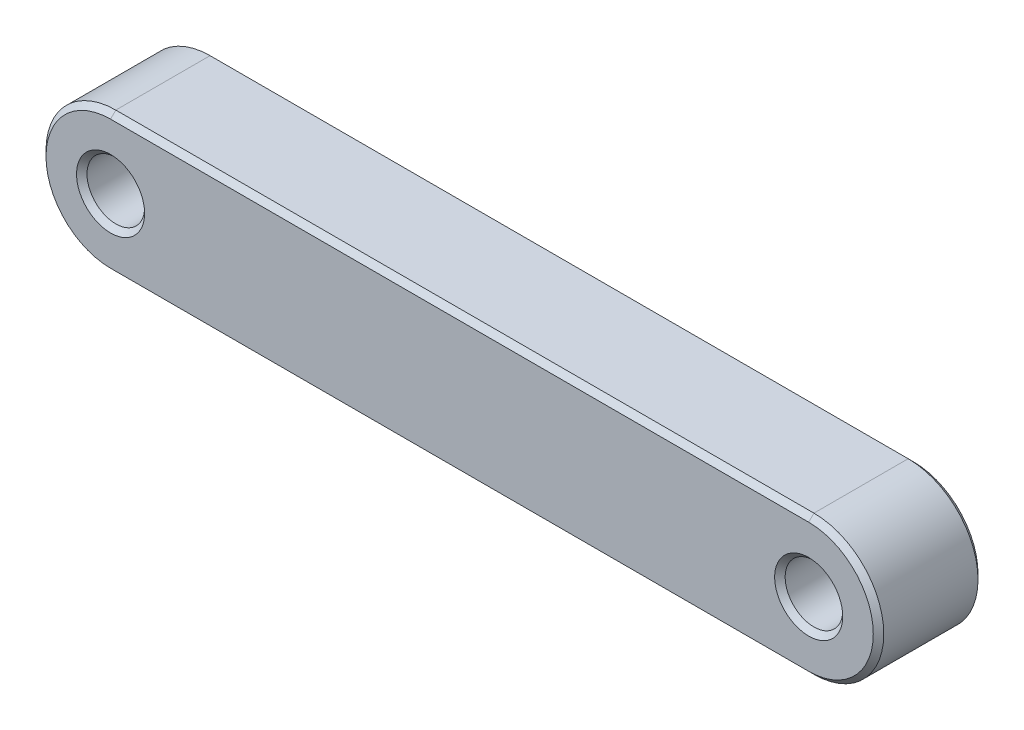
ISO-10303-21;
HEADER;
FILE_DESCRIPTION(('STEP AP214'),'2;1');
FILE_NAME('part.step','',(''),(''),'','','');
FILE_SCHEMA(('AUTOMOTIVE_DESIGN { 1 0 10303 214 1 1 1 1 }'));
ENDSEC;
DATA;
#1=APPLICATION_CONTEXT('core data for automotive mechanical design processes');
#2=APPLICATION_PROTOCOL_DEFINITION('international standard','automotive_design',2000,#1);
#3=PRODUCT_CONTEXT('',#1,'mechanical');
#4=PRODUCT('Part','Part','',(#3));
#5=PRODUCT_RELATED_PRODUCT_CATEGORY('part','',(#4));
#6=PRODUCT_DEFINITION_FORMATION('','',#4);
#7=PRODUCT_DEFINITION_CONTEXT('part definition',#1,'design');
#8=PRODUCT_DEFINITION('design','',#6,#7);
#9=PRODUCT_DEFINITION_SHAPE('','',#8);
#10=(LENGTH_UNIT() NAMED_UNIT(*) SI_UNIT(.MILLI.,.METRE.));
#11=(NAMED_UNIT(*) PLANE_ANGLE_UNIT() SI_UNIT($,.RADIAN.));
#12=(NAMED_UNIT(*) SI_UNIT($,.STERADIAN.) SOLID_ANGLE_UNIT());
#13=UNCERTAINTY_MEASURE_WITH_UNIT(LENGTH_MEASURE(1.E-05),#10,'distance_accuracy_value','');
#14=(GEOMETRIC_REPRESENTATION_CONTEXT(3) GLOBAL_UNCERTAINTY_ASSIGNED_CONTEXT((#13)) GLOBAL_UNIT_ASSIGNED_CONTEXT((#10,
#11,#12)) REPRESENTATION_CONTEXT('',''));
#15=CARTESIAN_POINT('',(0.,0.,0.));
#16=DIRECTION('',(0.,0.,1.));
#17=DIRECTION('',(1.,0.,0.));
#18=AXIS2_PLACEMENT_3D('',#15,#16,#17);
#19=CARTESIAN_POINT('',(-20.,0.,6.));
#20=DIRECTION('',(0.,0.,-1.));
#21=DIRECTION('',(-1.,0.,0.));
#22=AXIS2_PLACEMENT_3D('',#19,#20,#21);
#23=CYLINDRICAL_SURFACE('',#22,1.65);
#24=CARTESIAN_POINT('',(-20.,0.,5.7));
#25=DIRECTION('',(0.,0.,1.));
#26=DIRECTION('',(1.,0.,0.));
#27=AXIS2_PLACEMENT_3D('',#24,#25,#26);
#28=CIRCLE('',#27,1.65);
#29=CARTESIAN_POINT('',(-18.35,0.,5.7));
#30=VERTEX_POINT('',#29);
#31=EDGE_CURVE('E149',#30,#30,#28,.T.);
#32=ORIENTED_EDGE('',*,*,#31,.T.);
#33=EDGE_LOOP('',(#32));
#34=FACE_BOUND('',#33,.T.);
#35=CARTESIAN_POINT('',(-20.,0.,2.));
#36=DIRECTION('',(0.,0.,-1.));
#37=DIRECTION('',(-1.,0.,0.));
#38=AXIS2_PLACEMENT_3D('',#35,#36,#37);
#39=CIRCLE('',#38,1.65);
#40=CARTESIAN_POINT('',(-21.65,0.,2.));
#41=VERTEX_POINT('',#40);
#42=EDGE_CURVE('E284',#41,#41,#39,.T.);
#43=ORIENTED_EDGE('',*,*,#42,.T.);
#44=EDGE_LOOP('',(#43));
#45=FACE_BOUND('',#44,.T.);
#46=ADVANCED_FACE('F32',(#34,#45),#23,.F.);
#47=CARTESIAN_POINT('',(20.,0.,6.));
#48=DIRECTION('',(0.,0.,-1.));
#49=DIRECTION('',(-1.,0.,0.));
#50=AXIS2_PLACEMENT_3D('',#47,#48,#49);
#51=CYLINDRICAL_SURFACE('',#50,1.65);
#52=CARTESIAN_POINT('',(20.,0.,5.7));
#53=DIRECTION('',(0.,0.,1.));
#54=DIRECTION('',(1.,0.,0.));
#55=AXIS2_PLACEMENT_3D('',#52,#53,#54);
#56=CIRCLE('',#55,1.65);
#57=CARTESIAN_POINT('',(21.65,0.,5.7));
#58=VERTEX_POINT('',#57);
#59=EDGE_CURVE('E208',#58,#58,#56,.T.);
#60=ORIENTED_EDGE('',*,*,#59,.T.);
#61=EDGE_LOOP('',(#60));
#62=FACE_BOUND('',#61,.T.);
#63=CARTESIAN_POINT('',(20.,0.,2.));
#64=DIRECTION('',(0.,0.,-1.));
#65=DIRECTION('',(-1.,0.,0.));
#66=AXIS2_PLACEMENT_3D('',#63,#64,#65);
#67=CIRCLE('',#66,1.65);
#68=CARTESIAN_POINT('',(18.35,0.,2.));
#69=VERTEX_POINT('',#68);
#70=EDGE_CURVE('E195',#69,#69,#67,.T.);
#71=ORIENTED_EDGE('',*,*,#70,.T.);
#72=EDGE_LOOP('',(#71));
#73=FACE_BOUND('',#72,.T.);
#74=ADVANCED_FACE('F233',(#62,#73),#51,.F.);
#75=CARTESIAN_POINT('',(-20.,0.,6.));
#76=DIRECTION('',(0.,0.,1.));
#77=DIRECTION('',(1.,0.,0.));
#78=AXIS2_PLACEMENT_3D('',#75,#76,#77);
#79=PLANE('',#78);
#80=CARTESIAN_POINT('',(20.,0.,6.));
#81=DIRECTION('',(0.,0.,1.));
#82=DIRECTION('',(1.,0.,0.));
#83=AXIS2_PLACEMENT_3D('',#80,#81,#82);
#84=CIRCLE('',#83,1.95);
#85=CARTESIAN_POINT('',(21.95,0.,6.));
#86=VERTEX_POINT('',#85);
#87=EDGE_CURVE('E126',#86,#86,#84,.F.);
#88=ORIENTED_EDGE('',*,*,#87,.T.);
#89=EDGE_LOOP('',(#88));
#90=FACE_BOUND('',#89,.T.);
#91=CARTESIAN_POINT('',(20.,0.,6.));
#92=DIRECTION('',(0.,0.,1.));
#93=DIRECTION('',(1.,0.,0.));
#94=AXIS2_PLACEMENT_3D('',#91,#92,#93);
#95=CIRCLE('',#94,3.69999999999999);
#96=CARTESIAN_POINT('',(20.,-3.69999999999999,6.));
#97=VERTEX_POINT('',#96);
#98=CARTESIAN_POINT('',(20.,3.7,6.));
#99=VERTEX_POINT('',#98);
#100=EDGE_CURVE('E124',#97,#99,#95,.T.);
#101=ORIENTED_EDGE('',*,*,#100,.T.);
#102=DIRECTION('',(-1.,0.,0.));
#103=VECTOR('',#102,1.);
#104=CARTESIAN_POINT('',(-20.,3.69999999999999,6.));
#105=LINE('',#104,#103);
#106=CARTESIAN_POINT('',(-20.,3.69999999999999,6.));
#107=VERTEX_POINT('',#106);
#108=EDGE_CURVE('E104',#99,#107,#105,.T.);
#109=ORIENTED_EDGE('',*,*,#108,.T.);
#110=CARTESIAN_POINT('',(-20.,0.,6.));
#111=DIRECTION('',(0.,0.,1.));
#112=DIRECTION('',(1.,0.,0.));
#113=AXIS2_PLACEMENT_3D('',#110,#111,#112);
#114=CIRCLE('',#113,3.69999999999999);
#115=CARTESIAN_POINT('',(-20.,-3.69999999999999,6.));
#116=VERTEX_POINT('',#115);
#117=EDGE_CURVE('E112',#107,#116,#114,.T.);
#118=ORIENTED_EDGE('',*,*,#117,.T.);
#119=DIRECTION('',(1.,0.,0.));
#120=VECTOR('',#119,1.);
#121=CARTESIAN_POINT('',(20.,-3.69999999999999,6.));
#122=LINE('',#121,#120);
#123=EDGE_CURVE('E118',#116,#97,#122,.T.);
#124=ORIENTED_EDGE('',*,*,#123,.T.);
#125=EDGE_LOOP('',(#101,#109,#118,#124));
#126=FACE_BOUND('',#125,.T.);
#127=CARTESIAN_POINT('',(-20.,0.,6.));
#128=DIRECTION('',(0.,0.,1.));
#129=DIRECTION('',(1.,0.,0.));
#130=AXIS2_PLACEMENT_3D('',#127,#128,#129);
#131=CIRCLE('',#130,1.95);
#132=CARTESIAN_POINT('',(-18.05,0.,6.));
#133=VERTEX_POINT('',#132);
#134=EDGE_CURVE('E119',#133,#133,#131,.F.);
#135=ORIENTED_EDGE('',*,*,#134,.T.);
#136=EDGE_LOOP('',(#135));
#137=FACE_BOUND('',#136,.T.);
#138=ADVANCED_FACE('F121',(#90,#126,#137),#79,.T.);
#139=CARTESIAN_POINT('',(-20.,0.,0.));
#140=DIRECTION('',(0.,0.,1.));
#141=DIRECTION('',(1.,0.,0.));
#142=AXIS2_PLACEMENT_3D('',#139,#140,#141);
#143=PLANE('',#142);
#144=CARTESIAN_POINT('',(-20.,0.,0.));
#145=DIRECTION('',(0.,0.,1.));
#146=DIRECTION('',(1.,0.,0.));
#147=AXIS2_PLACEMENT_3D('',#144,#145,#146);
#148=CIRCLE('',#147,3.7);
#149=CARTESIAN_POINT('',(-20.,-3.7,0.));
#150=VERTEX_POINT('',#149);
#151=CARTESIAN_POINT('',(-20.,3.7,0.));
#152=VERTEX_POINT('',#151);
#153=EDGE_CURVE('E41',#150,#152,#148,.F.);
#154=ORIENTED_EDGE('',*,*,#153,.T.);
#155=DIRECTION('',(1.,0.,0.));
#156=VECTOR('',#155,1.);
#157=CARTESIAN_POINT('',(-20.,3.69999999999999,0.));
#158=LINE('',#157,#156);
#159=CARTESIAN_POINT('',(20.,3.70000000000001,0.));
#160=VERTEX_POINT('',#159);
#161=EDGE_CURVE('E11',#152,#160,#158,.T.);
#162=ORIENTED_EDGE('',*,*,#161,.T.);
#163=CARTESIAN_POINT('',(20.,0.,0.));
#164=DIRECTION('',(0.,0.,1.));
#165=DIRECTION('',(1.,0.,0.));
#166=AXIS2_PLACEMENT_3D('',#163,#164,#165);
#167=CIRCLE('',#166,3.7);
#168=CARTESIAN_POINT('',(20.,-3.69999999999999,0.));
#169=VERTEX_POINT('',#168);
#170=EDGE_CURVE('E154',#160,#169,#167,.F.);
#171=ORIENTED_EDGE('',*,*,#170,.T.);
#172=DIRECTION('',(-1.,0.,0.));
#173=VECTOR('',#172,1.);
#174=CARTESIAN_POINT('',(-20.,-3.7,0.));
#175=LINE('',#174,#173);
#176=EDGE_CURVE('E152',#169,#150,#175,.T.);
#177=ORIENTED_EDGE('',*,*,#176,.T.);
#178=EDGE_LOOP('',(#154,#162,#171,#177));
#179=FACE_BOUND('',#178,.T.);
#180=CARTESIAN_POINT('',(-20.,0.,0.));
#181=DIRECTION('',(0.,0.,-1.));
#182=DIRECTION('',(-1.,0.,0.));
#183=AXIS2_PLACEMENT_3D('',#180,#181,#182);
#184=CIRCLE('',#183,3.15);
#185=CARTESIAN_POINT('',(-23.15,0.,0.));
#186=VERTEX_POINT('',#185);
#187=EDGE_CURVE('E162',#186,#186,#184,.T.);
#188=ORIENTED_EDGE('',*,*,#187,.F.);
#189=EDGE_LOOP('',(#188));
#190=FACE_BOUND('',#189,.T.);
#191=CARTESIAN_POINT('',(20.,0.,0.));
#192=DIRECTION('',(0.,0.,-1.));
#193=DIRECTION('',(-1.,0.,0.));
#194=AXIS2_PLACEMENT_3D('',#191,#192,#193);
#195=CIRCLE('',#194,3.15);
#196=CARTESIAN_POINT('',(16.85,0.,0.));
#197=VERTEX_POINT('',#196);
#198=EDGE_CURVE('E289',#197,#197,#195,.T.);
#199=ORIENTED_EDGE('',*,*,#198,.F.);
#200=EDGE_LOOP('',(#199));
#201=FACE_BOUND('',#200,.T.);
#202=ADVANCED_FACE('F178',(#179,#190,#201),#143,.F.);
#203=CARTESIAN_POINT('',(-20.,0.,6.));
#204=DIRECTION('',(0.,0.,-1.));
#205=DIRECTION('',(-1.,0.,0.));
#206=AXIS2_PLACEMENT_3D('',#203,#204,#205);
#207=CYLINDRICAL_SURFACE('',#206,4.);
#208=DIRECTION('',(0.,0.,-1.));
#209=VECTOR('',#208,1.);
#210=CARTESIAN_POINT('',(-20.,-4.,6.));
#211=LINE('',#210,#209);
#212=CARTESIAN_POINT('',(-20.,-4.,5.7));
#213=VERTEX_POINT('',#212);
#214=CARTESIAN_POINT('',(-20.,-4.,0.299999999999995));
#215=VERTEX_POINT('',#214);
#216=EDGE_CURVE('E206',#213,#215,#211,.T.);
#217=ORIENTED_EDGE('',*,*,#216,.F.);
#218=CARTESIAN_POINT('',(-20.,0.,5.7));
#219=DIRECTION('',(0.,0.,1.));
#220=DIRECTION('',(1.,0.,0.));
#221=AXIS2_PLACEMENT_3D('',#218,#219,#220);
#222=CIRCLE('',#221,4.);
#223=CARTESIAN_POINT('',(-20.,4.,5.7));
#224=VERTEX_POINT('',#223);
#225=EDGE_CURVE('E147',#213,#224,#222,.F.);
#226=ORIENTED_EDGE('',*,*,#225,.T.);
#227=DIRECTION('',(0.,0.,-1.));
#228=VECTOR('',#227,1.);
#229=CARTESIAN_POINT('',(-20.,4.,6.));
#230=LINE('',#229,#228);
#231=CARTESIAN_POINT('',(-20.,4.,0.299999999999995));
#232=VERTEX_POINT('',#231);
#233=EDGE_CURVE('E191',#224,#232,#230,.T.);
#234=ORIENTED_EDGE('',*,*,#233,.T.);
#235=CARTESIAN_POINT('',(-20.,0.,0.299999999999995));
#236=DIRECTION('',(0.,0.,1.));
#237=DIRECTION('',(1.,0.,0.));
#238=AXIS2_PLACEMENT_3D('',#235,#236,#237);
#239=CIRCLE('',#238,4.);
#240=EDGE_CURVE('E145',#232,#215,#239,.T.);
#241=ORIENTED_EDGE('',*,*,#240,.T.);
#242=EDGE_LOOP('',(#217,#226,#234,#241));
#243=FACE_BOUND('',#242,.T.);
#244=ADVANCED_FACE('F194',(#243),#207,.T.);
#245=CARTESIAN_POINT('',(-20.,-4.,6.));
#246=DIRECTION('',(0.,1.,0.));
#247=DIRECTION('',(-1.,0.,0.));
#248=AXIS2_PLACEMENT_3D('',#245,#246,#247);
#249=PLANE('',#248);
#250=DIRECTION('',(0.,0.,-1.));
#251=VECTOR('',#250,1.);
#252=CARTESIAN_POINT('',(20.,-3.99999999999999,6.));
#253=LINE('',#252,#251);
#254=CARTESIAN_POINT('',(20.,-3.99999999999999,5.7));
#255=VERTEX_POINT('',#254);
#256=CARTESIAN_POINT('',(20.,-3.99999999999999,0.299999999999995));
#257=VERTEX_POINT('',#256);
#258=EDGE_CURVE('E197',#255,#257,#253,.T.);
#259=ORIENTED_EDGE('',*,*,#258,.F.);
#260=DIRECTION('',(-1.,0.,0.));
#261=VECTOR('',#260,1.);
#262=CARTESIAN_POINT('',(-20.,-4.,5.7));
#263=LINE('',#262,#261);
#264=EDGE_CURVE('E143',#255,#213,#263,.T.);
#265=ORIENTED_EDGE('',*,*,#264,.T.);
#266=ORIENTED_EDGE('',*,*,#216,.T.);
#267=DIRECTION('',(1.,0.,0.));
#268=VECTOR('',#267,1.);
#269=CARTESIAN_POINT('',(-20.,-4.,0.299999999999995));
#270=LINE('',#269,#268);
#271=EDGE_CURVE('E141',#215,#257,#270,.T.);
#272=ORIENTED_EDGE('',*,*,#271,.T.);
#273=EDGE_LOOP('',(#259,#265,#266,#272));
#274=FACE_BOUND('',#273,.T.);
#275=ADVANCED_FACE('F223',(#274),#249,.F.);
#276=CARTESIAN_POINT('',(20.,0.,6.));
#277=DIRECTION('',(0.,0.,-1.));
#278=DIRECTION('',(-1.,0.,0.));
#279=AXIS2_PLACEMENT_3D('',#276,#277,#278);
#280=CYLINDRICAL_SURFACE('',#279,4.);
#281=DIRECTION('',(0.,0.,-1.));
#282=VECTOR('',#281,1.);
#283=CARTESIAN_POINT('',(20.,4.00000000000001,6.));
#284=LINE('',#283,#282);
#285=CARTESIAN_POINT('',(20.,4.00000000000001,5.7));
#286=VERTEX_POINT('',#285);
#287=CARTESIAN_POINT('',(20.,4.00000000000001,0.299999999999995));
#288=VERTEX_POINT('',#287);
#289=EDGE_CURVE('E193',#286,#288,#284,.T.);
#290=ORIENTED_EDGE('',*,*,#289,.F.);
#291=CARTESIAN_POINT('',(20.,0.,5.7));
#292=DIRECTION('',(0.,0.,1.));
#293=DIRECTION('',(1.,0.,0.));
#294=AXIS2_PLACEMENT_3D('',#291,#292,#293);
#295=CIRCLE('',#294,4.);
#296=EDGE_CURVE('E139',#286,#255,#295,.F.);
#297=ORIENTED_EDGE('',*,*,#296,.T.);
#298=ORIENTED_EDGE('',*,*,#258,.T.);
#299=CARTESIAN_POINT('',(20.,0.,0.299999999999995));
#300=DIRECTION('',(0.,0.,1.));
#301=DIRECTION('',(1.,0.,0.));
#302=AXIS2_PLACEMENT_3D('',#299,#300,#301);
#303=CIRCLE('',#302,4.);
#304=EDGE_CURVE('E137',#257,#288,#303,.T.);
#305=ORIENTED_EDGE('',*,*,#304,.T.);
#306=EDGE_LOOP('',(#290,#297,#298,#305));
#307=FACE_BOUND('',#306,.T.);
#308=ADVANCED_FACE('F221',(#307),#280,.T.);
#309=CARTESIAN_POINT('',(-20.,4.,6.));
#310=DIRECTION('',(0.,-1.,0.));
#311=DIRECTION('',(1.,0.,0.));
#312=AXIS2_PLACEMENT_3D('',#309,#310,#311);
#313=PLANE('',#312);
#314=ORIENTED_EDGE('',*,*,#233,.F.);
#315=DIRECTION('',(1.,0.,0.));
#316=VECTOR('',#315,1.);
#317=CARTESIAN_POINT('',(20.,4.00000000000001,5.7));
#318=LINE('',#317,#316);
#319=EDGE_CURVE('E106',#224,#286,#318,.T.);
#320=ORIENTED_EDGE('',*,*,#319,.T.);
#321=ORIENTED_EDGE('',*,*,#289,.T.);
#322=DIRECTION('',(-1.,0.,0.));
#323=VECTOR('',#322,1.);
#324=CARTESIAN_POINT('',(-20.,4.,0.300000000000009));
#325=LINE('',#324,#323);
#326=EDGE_CURVE('E129',#288,#232,#325,.T.);
#327=ORIENTED_EDGE('',*,*,#326,.T.);
#328=EDGE_LOOP('',(#314,#320,#321,#327));
#329=FACE_BOUND('',#328,.T.);
#330=ADVANCED_FACE('F190',(#329),#313,.F.);
#331=CARTESIAN_POINT('',(20.,0.,0.5));
#332=DIRECTION('',(0.,0.,-1.));
#333=DIRECTION('',(-1.,0.,0.));
#334=AXIS2_PLACEMENT_3D('',#331,#332,#333);
#335=CONICAL_SURFACE('',#334,3.15,0.78539816339745);
#336=ORIENTED_EDGE('',*,*,#70,.F.);
#337=EDGE_LOOP('',(#336));
#338=FACE_BOUND('',#337,.T.);
#339=CARTESIAN_POINT('',(20.,0.,0.5));
#340=DIRECTION('',(0.,0.,-1.));
#341=DIRECTION('',(-1.,0.,0.));
#342=AXIS2_PLACEMENT_3D('',#339,#340,#341);
#343=CIRCLE('',#342,3.15);
#344=CARTESIAN_POINT('',(16.85,0.,0.5));
#345=VERTEX_POINT('',#344);
#346=EDGE_CURVE('E200',#345,#345,#343,.T.);
#347=ORIENTED_EDGE('',*,*,#346,.T.);
#348=EDGE_LOOP('',(#347));
#349=FACE_BOUND('',#348,.T.);
#350=ADVANCED_FACE('F250',(#338,#349),#335,.F.);
#351=CARTESIAN_POINT('',(20.,0.,0.));
#352=DIRECTION('',(0.,0.,-1.));
#353=DIRECTION('',(-1.,0.,0.));
#354=AXIS2_PLACEMENT_3D('',#351,#352,#353);
#355=CYLINDRICAL_SURFACE('',#354,3.15);
#356=ORIENTED_EDGE('',*,*,#346,.F.);
#357=EDGE_LOOP('',(#356));
#358=FACE_BOUND('',#357,.T.);
#359=ORIENTED_EDGE('',*,*,#198,.T.);
#360=EDGE_LOOP('',(#359));
#361=FACE_BOUND('',#360,.T.);
#362=ADVANCED_FACE('F254',(#358,#361),#355,.F.);
#363=CARTESIAN_POINT('',(-20.,0.,0.5));
#364=DIRECTION('',(0.,0.,-1.));
#365=DIRECTION('',(-1.,0.,0.));
#366=AXIS2_PLACEMENT_3D('',#363,#364,#365);
#367=CONICAL_SURFACE('',#366,3.15,0.78539816339745);
#368=ORIENTED_EDGE('',*,*,#42,.F.);
#369=EDGE_LOOP('',(#368));
#370=FACE_BOUND('',#369,.T.);
#371=CARTESIAN_POINT('',(-20.,0.,0.5));
#372=DIRECTION('',(0.,0.,-1.));
#373=DIRECTION('',(-1.,0.,0.));
#374=AXIS2_PLACEMENT_3D('',#371,#372,#373);
#375=CIRCLE('',#374,3.15);
#376=CARTESIAN_POINT('',(-23.15,0.,0.5));
#377=VERTEX_POINT('',#376);
#378=EDGE_CURVE('E280',#377,#377,#375,.T.);
#379=ORIENTED_EDGE('',*,*,#378,.T.);
#380=EDGE_LOOP('',(#379));
#381=FACE_BOUND('',#380,.T.);
#382=ADVANCED_FACE('F259',(#370,#381),#367,.F.);
#383=CARTESIAN_POINT('',(-20.,0.,0.));
#384=DIRECTION('',(0.,0.,-1.));
#385=DIRECTION('',(-1.,0.,0.));
#386=AXIS2_PLACEMENT_3D('',#383,#384,#385);
#387=CYLINDRICAL_SURFACE('',#386,3.15);
#388=ORIENTED_EDGE('',*,*,#378,.F.);
#389=EDGE_LOOP('',(#388));
#390=FACE_BOUND('',#389,.T.);
#391=ORIENTED_EDGE('',*,*,#187,.T.);
#392=EDGE_LOOP('',(#391));
#393=FACE_BOUND('',#392,.T.);
#394=ADVANCED_FACE('F267',(#390,#393),#387,.F.);
#395=CARTESIAN_POINT('',(20.,0.,5.7));
#396=DIRECTION('',(0.,0.,1.));
#397=DIRECTION('',(1.,0.,0.));
#398=AXIS2_PLACEMENT_3D('',#395,#396,#397);
#399=CONICAL_SURFACE('',#398,1.65,0.785398163397454);
#400=ORIENTED_EDGE('',*,*,#87,.F.);
#401=EDGE_LOOP('',(#400));
#402=FACE_BOUND('',#401,.T.);
#403=ORIENTED_EDGE('',*,*,#59,.F.);
#404=EDGE_LOOP('',(#403));
#405=FACE_BOUND('',#404,.T.);
#406=ADVANCED_FACE('F270',(#402,#405),#399,.F.);
#407=CARTESIAN_POINT('',(-20.,-3.69999999999999,6.));
#408=DIRECTION('',(0.,-0.707106781186539,0.707106781186556));
#409=DIRECTION('',(-1.,0.,0.));
#410=AXIS2_PLACEMENT_3D('',#407,#408,#409);
#411=PLANE('',#410);
#412=DIRECTION('',(0.,0.707106781186556,0.707106781186539));
#413=VECTOR('',#412,1.);
#414=CARTESIAN_POINT('',(-20.,-4.,5.7));
#415=LINE('',#414,#413);
#416=EDGE_CURVE('E115',#213,#116,#415,.T.);
#417=ORIENTED_EDGE('',*,*,#416,.F.);
#418=ORIENTED_EDGE('',*,*,#264,.F.);
#419=DIRECTION('',(0.,-0.707106781186556,-0.707106781186539));
#420=VECTOR('',#419,1.);
#421=CARTESIAN_POINT('',(20.,-3.69999999999999,6.));
#422=LINE('',#421,#420);
#423=EDGE_CURVE('E159',#97,#255,#422,.T.);
#424=ORIENTED_EDGE('',*,*,#423,.F.);
#425=ORIENTED_EDGE('',*,*,#123,.F.);
#426=EDGE_LOOP('',(#417,#418,#424,#425));
#427=FACE_BOUND('',#426,.T.);
#428=ADVANCED_FACE('F215',(#427),#411,.T.);
#429=CARTESIAN_POINT('',(20.,0.,6.));
#430=DIRECTION('',(0.,0.,-1.));
#431=DIRECTION('',(-1.,0.,0.));
#432=AXIS2_PLACEMENT_3D('',#429,#430,#431);
#433=CONICAL_SURFACE('',#432,3.69999999999999,0.78539816339746);
#434=ORIENTED_EDGE('',*,*,#423,.T.);
#435=ORIENTED_EDGE('',*,*,#296,.F.);
#436=DIRECTION('',(0.,0.707106781186555,-0.70710678118654));
#437=VECTOR('',#436,1.);
#438=CARTESIAN_POINT('',(20.,3.7,6.));
#439=LINE('',#438,#437);
#440=EDGE_CURVE('E109',#99,#286,#439,.T.);
#441=ORIENTED_EDGE('',*,*,#440,.F.);
#442=ORIENTED_EDGE('',*,*,#100,.F.);
#443=EDGE_LOOP('',(#434,#435,#441,#442));
#444=FACE_BOUND('',#443,.T.);
#445=ADVANCED_FACE('F218',(#444),#433,.T.);
#446=CARTESIAN_POINT('',(-20.,0.,6.));
#447=DIRECTION('',(0.,0.,-1.));
#448=DIRECTION('',(-1.,0.,0.));
#449=AXIS2_PLACEMENT_3D('',#446,#447,#448);
#450=CONICAL_SURFACE('',#449,3.69999999999999,0.78539816339746);
#451=ORIENTED_EDGE('',*,*,#416,.T.);
#452=ORIENTED_EDGE('',*,*,#117,.F.);
#453=DIRECTION('',(0.,-0.707106781186556,0.707106781186539));
#454=VECTOR('',#453,1.);
#455=CARTESIAN_POINT('',(-20.,4.,5.7));
#456=LINE('',#455,#454);
#457=EDGE_CURVE('E100',#224,#107,#456,.T.);
#458=ORIENTED_EDGE('',*,*,#457,.F.);
#459=ORIENTED_EDGE('',*,*,#225,.F.);
#460=EDGE_LOOP('',(#451,#452,#458,#459));
#461=FACE_BOUND('',#460,.T.);
#462=ADVANCED_FACE('F113',(#461),#450,.T.);
#463=CARTESIAN_POINT('',(-20.,3.69999999999999,6.));
#464=DIRECTION('',(0.,0.707106781186539,0.707106781186556));
#465=DIRECTION('',(1.,0.,0.));
#466=AXIS2_PLACEMENT_3D('',#463,#464,#465);
#467=PLANE('',#466);
#468=ORIENTED_EDGE('',*,*,#440,.T.);
#469=ORIENTED_EDGE('',*,*,#319,.F.);
#470=ORIENTED_EDGE('',*,*,#457,.T.);
#471=ORIENTED_EDGE('',*,*,#108,.F.);
#472=EDGE_LOOP('',(#468,#469,#470,#471));
#473=FACE_BOUND('',#472,.T.);
#474=ADVANCED_FACE('F102',(#473),#467,.T.);
#475=CARTESIAN_POINT('',(-20.,0.,5.7));
#476=DIRECTION('',(0.,0.,1.));
#477=DIRECTION('',(1.,0.,0.));
#478=AXIS2_PLACEMENT_3D('',#475,#476,#477);
#479=CONICAL_SURFACE('',#478,1.65,0.785398163397454);
#480=ORIENTED_EDGE('',*,*,#134,.F.);
#481=EDGE_LOOP('',(#480));
#482=FACE_BOUND('',#481,.T.);
#483=ORIENTED_EDGE('',*,*,#31,.F.);
#484=EDGE_LOOP('',(#483));
#485=FACE_BOUND('',#484,.T.);
#486=ADVANCED_FACE('F307',(#482,#485),#479,.F.);
#487=CARTESIAN_POINT('',(-20.,-4.,0.299999999999995));
#488=DIRECTION('',(0.,0.707106781186539,0.707106781186556));
#489=DIRECTION('',(1.,0.,0.));
#490=AXIS2_PLACEMENT_3D('',#487,#488,#489);
#491=PLANE('',#490);
#492=DIRECTION('',(0.,-0.707106781186556,0.707106781186539));
#493=VECTOR('',#492,1.);
#494=CARTESIAN_POINT('',(-20.,-3.7,0.));
#495=LINE('',#494,#493);
#496=EDGE_CURVE('E165',#150,#215,#495,.T.);
#497=ORIENTED_EDGE('',*,*,#496,.F.);
#498=ORIENTED_EDGE('',*,*,#176,.F.);
#499=DIRECTION('',(0.,0.707106781186556,-0.707106781186539));
#500=VECTOR('',#499,1.);
#501=CARTESIAN_POINT('',(20.,-3.99999999999999,0.299999999999995));
#502=LINE('',#501,#500);
#503=EDGE_CURVE('E36',#257,#169,#502,.T.);
#504=ORIENTED_EDGE('',*,*,#503,.F.);
#505=ORIENTED_EDGE('',*,*,#271,.F.);
#506=EDGE_LOOP('',(#497,#498,#504,#505));
#507=FACE_BOUND('',#506,.T.);
#508=ADVANCED_FACE('F34',(#507),#491,.F.);
#509=CARTESIAN_POINT('',(20.,0.,0.299999999999995));
#510=DIRECTION('',(0.,0.,1.));
#511=DIRECTION('',(1.,0.,0.));
#512=AXIS2_PLACEMENT_3D('',#509,#510,#511);
#513=CONICAL_SURFACE('',#512,4.,0.78539816339746);
#514=ORIENTED_EDGE('',*,*,#503,.T.);
#515=ORIENTED_EDGE('',*,*,#170,.F.);
#516=DIRECTION('',(0.,-0.707106781186555,-0.70710678118654));
#517=VECTOR('',#516,1.);
#518=CARTESIAN_POINT('',(20.,4.00000000000001,0.299999999999995));
#519=LINE('',#518,#517);
#520=EDGE_CURVE('E54',#288,#160,#519,.T.);
#521=ORIENTED_EDGE('',*,*,#520,.F.);
#522=ORIENTED_EDGE('',*,*,#304,.F.);
#523=EDGE_LOOP('',(#514,#515,#521,#522));
#524=FACE_BOUND('',#523,.T.);
#525=ADVANCED_FACE('F174',(#524),#513,.T.);
#526=CARTESIAN_POINT('',(-20.,0.,0.299999999999995));
#527=DIRECTION('',(0.,0.,1.));
#528=DIRECTION('',(1.,0.,0.));
#529=AXIS2_PLACEMENT_3D('',#526,#527,#528);
#530=CONICAL_SURFACE('',#529,4.,0.78539816339746);
#531=ORIENTED_EDGE('',*,*,#496,.T.);
#532=ORIENTED_EDGE('',*,*,#240,.F.);
#533=DIRECTION('',(0.,0.707106781186556,0.707106781186539));
#534=VECTOR('',#533,1.);
#535=CARTESIAN_POINT('',(-20.,3.7,0.));
#536=LINE('',#535,#534);
#537=EDGE_CURVE('E163',#152,#232,#536,.T.);
#538=ORIENTED_EDGE('',*,*,#537,.F.);
#539=ORIENTED_EDGE('',*,*,#153,.F.);
#540=EDGE_LOOP('',(#531,#532,#538,#539));
#541=FACE_BOUND('',#540,.T.);
#542=ADVANCED_FACE('F182',(#541),#530,.T.);
#543=CARTESIAN_POINT('',(-20.,4.,0.300000000000009));
#544=DIRECTION('',(0.,-0.707106781186547,0.707106781186547));
#545=DIRECTION('',(-1.,0.,0.));
#546=AXIS2_PLACEMENT_3D('',#543,#544,#545);
#547=PLANE('',#546);
#548=ORIENTED_EDGE('',*,*,#520,.T.);
#549=ORIENTED_EDGE('',*,*,#161,.F.);
#550=ORIENTED_EDGE('',*,*,#537,.T.);
#551=ORIENTED_EDGE('',*,*,#326,.F.);
#552=EDGE_LOOP('',(#548,#549,#550,#551));
#553=FACE_BOUND('',#552,.T.);
#554=ADVANCED_FACE('F181',(#553),#547,.F.);
#555=CLOSED_SHELL('',(#46,#74,#138,#202,#244,#275,#308,#330,#350,#362,#382,#394,#406,#428,#445,
#462,#474,#486,#508,#525,#542,#554));
#556=MANIFOLD_SOLID_BREP('B2',#555);
#557=ADVANCED_BREP_SHAPE_REPRESENTATION('',(#18,#556),#14);
#558=SHAPE_DEFINITION_REPRESENTATION(#9,#557);
ENDSEC;
END-ISO-10303-21;
